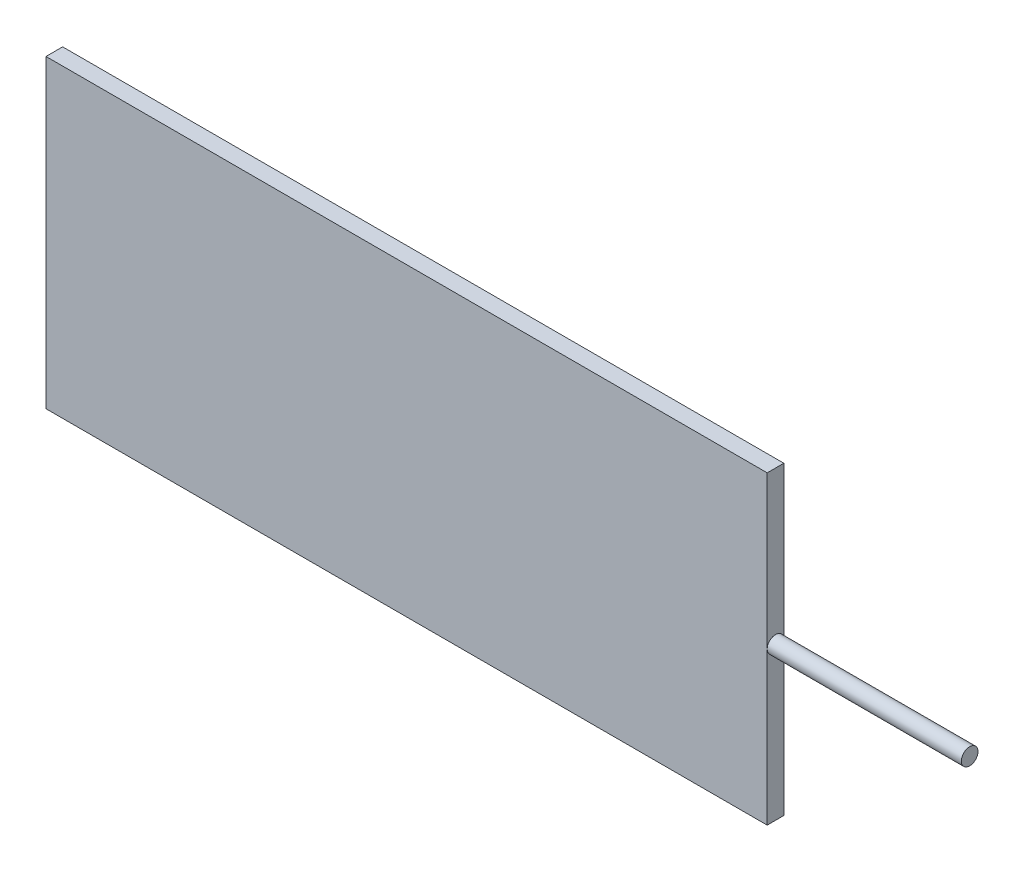
ISO-10303-21;
HEADER;
FILE_DESCRIPTION(('STEP AP214'),'2;1');
FILE_NAME('part.step','',(''),(''),'','','');
FILE_SCHEMA(('AUTOMOTIVE_DESIGN { 1 0 10303 214 1 1 1 1 }'));
ENDSEC;
DATA;
#1=APPLICATION_CONTEXT('core data for automotive mechanical design processes');
#2=APPLICATION_PROTOCOL_DEFINITION('international standard','automotive_design',2000,#1);
#3=PRODUCT_CONTEXT('',#1,'mechanical');
#4=PRODUCT('Part','Part','',(#3));
#5=PRODUCT_RELATED_PRODUCT_CATEGORY('part','',(#4));
#6=PRODUCT_DEFINITION_FORMATION('','',#4);
#7=PRODUCT_DEFINITION_CONTEXT('part definition',#1,'design');
#8=PRODUCT_DEFINITION('design','',#6,#7);
#9=PRODUCT_DEFINITION_SHAPE('','',#8);
#10=(LENGTH_UNIT() NAMED_UNIT(*) SI_UNIT(.MILLI.,.METRE.));
#11=(NAMED_UNIT(*) PLANE_ANGLE_UNIT() SI_UNIT($,.RADIAN.));
#12=(NAMED_UNIT(*) SI_UNIT($,.STERADIAN.) SOLID_ANGLE_UNIT());
#13=UNCERTAINTY_MEASURE_WITH_UNIT(LENGTH_MEASURE(1.E-05),#10,'distance_accuracy_value','');
#14=(GEOMETRIC_REPRESENTATION_CONTEXT(3) GLOBAL_UNCERTAINTY_ASSIGNED_CONTEXT((#13)) GLOBAL_UNIT_ASSIGNED_CONTEXT((#10,
#11,#12)) REPRESENTATION_CONTEXT('',''));
#15=CARTESIAN_POINT('',(0.,0.,0.));
#16=DIRECTION('',(0.,0.,1.));
#17=DIRECTION('',(1.,0.,0.));
#18=AXIS2_PLACEMENT_3D('',#15,#16,#17);
#19=CARTESIAN_POINT('',(260.,0.,6.));
#20=DIRECTION('',(-1.,0.,0.));
#21=DIRECTION('',(0.,0.,1.));
#22=AXIS2_PLACEMENT_3D('',#19,#20,#21);
#23=PLANE('',#22);
#24=CARTESIAN_POINT('',(260.,55.,3.));
#25=DIRECTION('',(1.,0.,0.));
#26=DIRECTION('',(0.,0.,-1.));
#27=AXIS2_PLACEMENT_3D('',#24,#25,#26);
#28=CIRCLE('',#27,3.);
#29=CARTESIAN_POINT('',(260.,55.,0.));
#30=VERTEX_POINT('',#29);
#31=CARTESIAN_POINT('',(260.,55.,6.));
#32=VERTEX_POINT('',#31);
#33=EDGE_CURVE('E50',#30,#32,#28,.T.);
#34=ORIENTED_EDGE('',*,*,#33,.F.);
#35=DIRECTION('',(0.,1.,0.));
#36=VECTOR('',#35,1.);
#37=CARTESIAN_POINT('',(260.,0.,0.));
#38=LINE('',#37,#36);
#39=CARTESIAN_POINT('',(260.,110.,0.));
#40=VERTEX_POINT('',#39);
#41=EDGE_CURVE('E103',#30,#40,#38,.T.);
#42=ORIENTED_EDGE('',*,*,#41,.T.);
#43=DIRECTION('',(0.,0.,-1.));
#44=VECTOR('',#43,1.);
#45=CARTESIAN_POINT('',(260.,110.,6.));
#46=LINE('',#45,#44);
#47=CARTESIAN_POINT('',(260.,110.,6.));
#48=VERTEX_POINT('',#47);
#49=EDGE_CURVE('E164',#48,#40,#46,.T.);
#50=ORIENTED_EDGE('',*,*,#49,.F.);
#51=DIRECTION('',(0.,1.,0.));
#52=VECTOR('',#51,1.);
#53=CARTESIAN_POINT('',(260.,0.,6.));
#54=LINE('',#53,#52);
#55=EDGE_CURVE('E113',#32,#48,#54,.T.);
#56=ORIENTED_EDGE('',*,*,#55,.F.);
#57=EDGE_LOOP('',(#34,#42,#50,#56));
#58=FACE_BOUND('',#57,.T.);
#59=ADVANCED_FACE('F39',(#58),#23,.F.);
#60=CARTESIAN_POINT('',(0.,0.,6.));
#61=DIRECTION('',(1.,0.,0.));
#62=DIRECTION('',(0.,0.,-1.));
#63=AXIS2_PLACEMENT_3D('',#60,#61,#62);
#64=PLANE('',#63);
#65=DIRECTION('',(0.,-1.,0.));
#66=VECTOR('',#65,1.);
#67=CARTESIAN_POINT('',(0.,0.,0.));
#68=LINE('',#67,#66);
#69=CARTESIAN_POINT('',(0.,110.,0.));
#70=VERTEX_POINT('',#69);
#71=CARTESIAN_POINT('',(0.,0.,0.));
#72=VERTEX_POINT('',#71);
#73=EDGE_CURVE('E152',#70,#72,#68,.T.);
#74=ORIENTED_EDGE('',*,*,#73,.T.);
#75=DIRECTION('',(0.,0.,-1.));
#76=VECTOR('',#75,1.);
#77=CARTESIAN_POINT('',(0.,0.,6.));
#78=LINE('',#77,#76);
#79=CARTESIAN_POINT('',(0.,0.,6.));
#80=VERTEX_POINT('',#79);
#81=EDGE_CURVE('E43',#80,#72,#78,.T.);
#82=ORIENTED_EDGE('',*,*,#81,.F.);
#83=DIRECTION('',(0.,-1.,0.));
#84=VECTOR('',#83,1.);
#85=CARTESIAN_POINT('',(0.,0.,6.));
#86=LINE('',#85,#84);
#87=CARTESIAN_POINT('',(0.,110.,6.));
#88=VERTEX_POINT('',#87);
#89=EDGE_CURVE('E160',#88,#80,#86,.T.);
#90=ORIENTED_EDGE('',*,*,#89,.F.);
#91=DIRECTION('',(0.,0.,-1.));
#92=VECTOR('',#91,1.);
#93=CARTESIAN_POINT('',(0.,110.,6.));
#94=LINE('',#93,#92);
#95=EDGE_CURVE('E161',#88,#70,#94,.T.);
#96=ORIENTED_EDGE('',*,*,#95,.T.);
#97=EDGE_LOOP('',(#74,#82,#90,#96));
#98=FACE_BOUND('',#97,.T.);
#99=ADVANCED_FACE('F41',(#98),#64,.F.);
#100=CARTESIAN_POINT('',(0.,0.,6.));
#101=DIRECTION('',(0.,1.,0.));
#102=DIRECTION('',(0.,0.,1.));
#103=AXIS2_PLACEMENT_3D('',#100,#101,#102);
#104=PLANE('',#103);
#105=DIRECTION('',(1.,0.,0.));
#106=VECTOR('',#105,1.);
#107=CARTESIAN_POINT('',(0.,0.,0.));
#108=LINE('',#107,#106);
#109=CARTESIAN_POINT('',(260.,0.,0.));
#110=VERTEX_POINT('',#109);
#111=EDGE_CURVE('E111',#72,#110,#108,.T.);
#112=ORIENTED_EDGE('',*,*,#111,.T.);
#113=DIRECTION('',(0.,0.,-1.));
#114=VECTOR('',#113,1.);
#115=CARTESIAN_POINT('',(260.,0.,6.));
#116=LINE('',#115,#114);
#117=CARTESIAN_POINT('',(260.,0.,6.));
#118=VERTEX_POINT('',#117);
#119=EDGE_CURVE('E100',#118,#110,#116,.T.);
#120=ORIENTED_EDGE('',*,*,#119,.F.);
#121=DIRECTION('',(1.,0.,0.));
#122=VECTOR('',#121,1.);
#123=CARTESIAN_POINT('',(0.,0.,6.));
#124=LINE('',#123,#122);
#125=EDGE_CURVE('E93',#80,#118,#124,.T.);
#126=ORIENTED_EDGE('',*,*,#125,.F.);
#127=ORIENTED_EDGE('',*,*,#81,.T.);
#128=EDGE_LOOP('',(#112,#120,#126,#127));
#129=FACE_BOUND('',#128,.T.);
#130=ADVANCED_FACE('F138',(#129),#104,.F.);
#131=EDGE_CURVE('E11',#32,#30,#28,.T.);
#132=ORIENTED_EDGE('',*,*,#131,.F.);
#133=EDGE_CURVE('E170',#118,#32,#54,.T.);
#134=ORIENTED_EDGE('',*,*,#133,.F.);
#135=ORIENTED_EDGE('',*,*,#119,.T.);
#136=EDGE_CURVE('E97',#110,#30,#38,.T.);
#137=ORIENTED_EDGE('',*,*,#136,.T.);
#138=EDGE_LOOP('',(#132,#134,#135,#137));
#139=FACE_BOUND('',#138,.T.);
#140=ADVANCED_FACE('F99',(#139),#23,.F.);
#141=CARTESIAN_POINT('',(0.,110.,6.));
#142=DIRECTION('',(0.,-1.,0.));
#143=DIRECTION('',(0.,0.,-1.));
#144=AXIS2_PLACEMENT_3D('',#141,#142,#143);
#145=PLANE('',#144);
#146=DIRECTION('',(-1.,0.,0.));
#147=VECTOR('',#146,1.);
#148=CARTESIAN_POINT('',(0.,110.,0.));
#149=LINE('',#148,#147);
#150=EDGE_CURVE('E85',#40,#70,#149,.T.);
#151=ORIENTED_EDGE('',*,*,#150,.T.);
#152=ORIENTED_EDGE('',*,*,#95,.F.);
#153=DIRECTION('',(-1.,0.,0.));
#154=VECTOR('',#153,1.);
#155=CARTESIAN_POINT('',(0.,110.,6.));
#156=LINE('',#155,#154);
#157=EDGE_CURVE('E64',#48,#88,#156,.T.);
#158=ORIENTED_EDGE('',*,*,#157,.F.);
#159=ORIENTED_EDGE('',*,*,#49,.T.);
#160=EDGE_LOOP('',(#151,#152,#158,#159));
#161=FACE_BOUND('',#160,.T.);
#162=ADVANCED_FACE('F142',(#161),#145,.F.);
#163=CARTESIAN_POINT('',(0.,0.,6.));
#164=DIRECTION('',(0.,0.,-1.));
#165=DIRECTION('',(-1.,0.,0.));
#166=AXIS2_PLACEMENT_3D('',#163,#164,#165);
#167=PLANE('',#166);
#168=ORIENTED_EDGE('',*,*,#89,.T.);
#169=ORIENTED_EDGE('',*,*,#125,.T.);
#170=ORIENTED_EDGE('',*,*,#133,.T.);
#171=ORIENTED_EDGE('',*,*,#55,.T.);
#172=ORIENTED_EDGE('',*,*,#157,.T.);
#173=EDGE_LOOP('',(#168,#169,#170,#171,#172));
#174=FACE_BOUND('',#173,.T.);
#175=ADVANCED_FACE('F129',(#174),#167,.F.);
#176=CARTESIAN_POINT('',(0.,0.,0.));
#177=DIRECTION('',(0.,0.,-1.));
#178=DIRECTION('',(-1.,0.,0.));
#179=AXIS2_PLACEMENT_3D('',#176,#177,#178);
#180=PLANE('',#179);
#181=ORIENTED_EDGE('',*,*,#73,.F.);
#182=ORIENTED_EDGE('',*,*,#150,.F.);
#183=ORIENTED_EDGE('',*,*,#41,.F.);
#184=ORIENTED_EDGE('',*,*,#136,.F.);
#185=ORIENTED_EDGE('',*,*,#111,.F.);
#186=EDGE_LOOP('',(#181,#182,#183,#184,#185));
#187=FACE_BOUND('',#186,.T.);
#188=ADVANCED_FACE('F107',(#187),#180,.T.);
#189=CARTESIAN_POINT('',(330.,55.,3.));
#190=DIRECTION('',(-1.,0.,0.));
#191=DIRECTION('',(0.,0.,1.));
#192=AXIS2_PLACEMENT_3D('',#189,#190,#191);
#193=CYLINDRICAL_SURFACE('',#192,3.);
#194=CARTESIAN_POINT('',(330.,55.,3.));
#195=DIRECTION('',(1.,0.,0.));
#196=DIRECTION('',(0.,0.,-1.));
#197=AXIS2_PLACEMENT_3D('',#194,#195,#196);
#198=CIRCLE('',#197,3.);
#199=CARTESIAN_POINT('',(330.,55.,0.));
#200=VERTEX_POINT('',#199);
#201=EDGE_CURVE('E117',#200,#200,#198,.T.);
#202=ORIENTED_EDGE('',*,*,#201,.F.);
#203=EDGE_LOOP('',(#202));
#204=FACE_BOUND('',#203,.T.);
#205=ORIENTED_EDGE('',*,*,#33,.T.);
#206=ORIENTED_EDGE('',*,*,#131,.T.);
#207=EDGE_LOOP('',(#205,#206));
#208=FACE_BOUND('',#207,.T.);
#209=ADVANCED_FACE('F118',(#204,#208),#193,.T.);
#210=CARTESIAN_POINT('',(330.,55.,3.));
#211=DIRECTION('',(1.,0.,0.));
#212=DIRECTION('',(0.,0.,-1.));
#213=AXIS2_PLACEMENT_3D('',#210,#211,#212);
#214=PLANE('',#213);
#215=ORIENTED_EDGE('',*,*,#201,.T.);
#216=EDGE_LOOP('',(#215));
#217=FACE_BOUND('',#216,.T.);
#218=ADVANCED_FACE('F120',(#217),#214,.T.);
#219=CLOSED_SHELL('',(#59,#99,#130,#140,#162,#175,#188,#209,#218));
#220=MANIFOLD_SOLID_BREP('B2',#219);
#221=ADVANCED_BREP_SHAPE_REPRESENTATION('',(#18,#220),#14);
#222=SHAPE_DEFINITION_REPRESENTATION(#9,#221);
ENDSEC;
END-ISO-10303-21;
